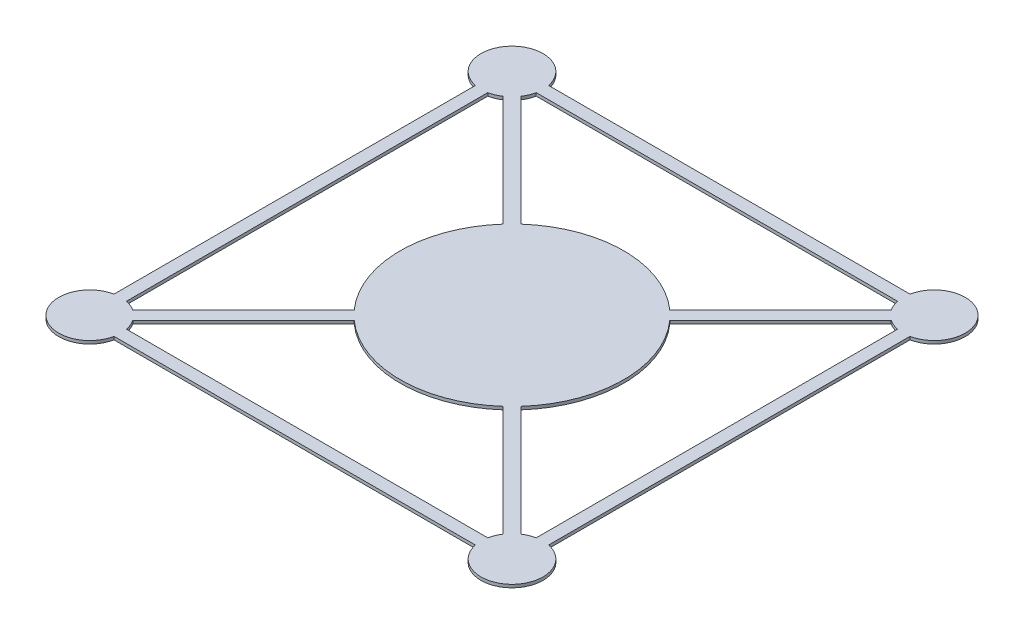
ISO-10303-21;
HEADER;
FILE_DESCRIPTION(('STEP AP214'),'2;1');
FILE_NAME('part.step','',(''),(''),'','','');
FILE_SCHEMA(('AUTOMOTIVE_DESIGN { 1 0 10303 214 1 1 1 1 }'));
ENDSEC;
DATA;
#1=APPLICATION_CONTEXT('core data for automotive mechanical design processes');
#2=APPLICATION_PROTOCOL_DEFINITION('international standard','automotive_design',2000,#1);
#3=PRODUCT_CONTEXT('',#1,'mechanical');
#4=PRODUCT('Part','Part','',(#3));
#5=PRODUCT_RELATED_PRODUCT_CATEGORY('part','',(#4));
#6=PRODUCT_DEFINITION_FORMATION('','',#4);
#7=PRODUCT_DEFINITION_CONTEXT('part definition',#1,'design');
#8=PRODUCT_DEFINITION('design','',#6,#7);
#9=PRODUCT_DEFINITION_SHAPE('','',#8);
#10=(LENGTH_UNIT() NAMED_UNIT(*) SI_UNIT(.MILLI.,.METRE.));
#11=(NAMED_UNIT(*) PLANE_ANGLE_UNIT() SI_UNIT($,.RADIAN.));
#12=(NAMED_UNIT(*) SI_UNIT($,.STERADIAN.) SOLID_ANGLE_UNIT());
#13=UNCERTAINTY_MEASURE_WITH_UNIT(LENGTH_MEASURE(1.E-05),#10,'distance_accuracy_value','');
#14=(GEOMETRIC_REPRESENTATION_CONTEXT(3) GLOBAL_UNCERTAINTY_ASSIGNED_CONTEXT((#13)) GLOBAL_UNIT_ASSIGNED_CONTEXT((#10,
#11,#12)) REPRESENTATION_CONTEXT('',''));
#15=CARTESIAN_POINT('',(0.,0.,0.));
#16=DIRECTION('',(0.,0.,1.));
#17=DIRECTION('',(1.,0.,0.));
#18=AXIS2_PLACEMENT_3D('',#15,#16,#17);
#19=CARTESIAN_POINT('',(0.,1.5748,0.));
#20=DIRECTION('',(0.,1.,0.));
#21=DIRECTION('',(0.,0.,1.));
#22=AXIS2_PLACEMENT_3D('',#19,#20,#21);
#23=PLANE('',#22);
#24=DIRECTION('',(0.707106781186547,0.,0.707106781186548));
#25=VECTOR('',#24,1.);
#26=CARTESIAN_POINT('',(150.543805491433,1.5748,-69.8463225691015));
#27=LINE('',#26,#25);
#28=CARTESIAN_POINT('',(150.543805491433,1.5748,-69.8463225691015));
#29=VERTEX_POINT('',#28);
#30=CARTESIAN_POINT('',(207.146541402205,1.5748,-13.2435866583297));
#31=VERTEX_POINT('',#30);
#32=EDGE_CURVE('E299',#29,#31,#27,.T.);
#33=ORIENTED_EDGE('',*,*,#32,.F.);
#34=CARTESIAN_POINT('',(107.95,1.5748,-107.95));
#35=DIRECTION('',(0.,-1.,0.));
#36=DIRECTION('',(0.,0.,1.));
#37=AXIS2_PLACEMENT_3D('',#34,#35,#36);
#38=CIRCLE('',#37,57.15);
#39=CARTESIAN_POINT('',(150.543805491433,1.5748,-146.053677430899));
#40=VERTEX_POINT('',#39);
#41=EDGE_CURVE('E297',#40,#29,#38,.T.);
#42=ORIENTED_EDGE('',*,*,#41,.F.);
#43=DIRECTION('',(-0.707106781186547,0.,0.707106781186548));
#44=VECTOR('',#43,1.);
#45=CARTESIAN_POINT('',(150.543805491433,1.5748,-146.053677430899));
#46=LINE('',#45,#44);
#47=CARTESIAN_POINT('',(207.146541402205,1.5748,-202.65641334167));
#48=VERTEX_POINT('',#47);
#49=EDGE_CURVE('E309',#48,#40,#46,.T.);
#50=ORIENTED_EDGE('',*,*,#49,.F.);
#51=CARTESIAN_POINT('',(215.9,1.5748,-215.9));
#52=DIRECTION('',(0.,-1.,0.));
#53=DIRECTION('',(0.,0.,1.));
#54=AXIS2_PLACEMENT_3D('',#51,#52,#53);
#55=CIRCLE('',#54,15.875);
#56=CARTESIAN_POINT('',(212.725,1.5748,-200.345740133327));
#57=VERTEX_POINT('',#56);
#58=EDGE_CURVE('E306',#57,#48,#55,.T.);
#59=ORIENTED_EDGE('',*,*,#58,.F.);
#60=DIRECTION('',(0.,0.,-1.));
#61=VECTOR('',#60,1.);
#62=CARTESIAN_POINT('',(212.725,1.5748,-15.5542598666732));
#63=LINE('',#62,#61);
#64=CARTESIAN_POINT('',(212.725,1.5748,-15.5542598666732));
#65=VERTEX_POINT('',#64);
#66=EDGE_CURVE('E304',#65,#57,#63,.T.);
#67=ORIENTED_EDGE('',*,*,#66,.F.);
#68=CARTESIAN_POINT('',(215.9,1.5748,0.));
#69=DIRECTION('',(0.,-1.,0.));
#70=DIRECTION('',(0.,0.,1.));
#71=AXIS2_PLACEMENT_3D('',#68,#69,#70);
#72=CIRCLE('',#71,15.875);
#73=EDGE_CURVE('E302',#31,#65,#72,.T.);
#74=ORIENTED_EDGE('',*,*,#73,.F.);
#75=EDGE_LOOP('',(#33,#42,#50,#59,#67,#74));
#76=FACE_BOUND('',#75,.T.);
#77=DIRECTION('',(-1.,0.,0.));
#78=VECTOR('',#77,1.);
#79=CARTESIAN_POINT('',(15.5542598666732,1.5748,-212.725));
#80=LINE('',#79,#78);
#81=CARTESIAN_POINT('',(200.345740133327,1.5748,-212.725));
#82=VERTEX_POINT('',#81);
#83=CARTESIAN_POINT('',(15.5542598666732,1.5748,-212.725));
#84=VERTEX_POINT('',#83);
#85=EDGE_CURVE('E389',#82,#84,#80,.T.);
#86=ORIENTED_EDGE('',*,*,#85,.F.);
#87=CARTESIAN_POINT('',(215.9,1.5748,-215.9));
#88=DIRECTION('',(0.,-1.,0.));
#89=DIRECTION('',(0.,0.,1.));
#90=AXIS2_PLACEMENT_3D('',#87,#88,#89);
#91=CIRCLE('',#90,15.875);
#92=CARTESIAN_POINT('',(202.65641334167,1.5748,-207.146541402205));
#93=VERTEX_POINT('',#92);
#94=EDGE_CURVE('E387',#93,#82,#91,.T.);
#95=ORIENTED_EDGE('',*,*,#94,.F.);
#96=DIRECTION('',(0.707106781186548,0.,-0.707106781186547));
#97=VECTOR('',#96,1.);
#98=CARTESIAN_POINT('',(146.053677430899,1.5748,-150.543805491433));
#99=LINE('',#98,#97);
#100=CARTESIAN_POINT('',(146.053677430899,1.5748,-150.543805491433));
#101=VERTEX_POINT('',#100);
#102=EDGE_CURVE('E399',#101,#93,#99,.T.);
#103=ORIENTED_EDGE('',*,*,#102,.F.);
#104=CARTESIAN_POINT('',(107.95,1.5748,-107.95));
#105=DIRECTION('',(0.,-1.,0.));
#106=DIRECTION('',(0.,0.,1.));
#107=AXIS2_PLACEMENT_3D('',#104,#105,#106);
#108=CIRCLE('',#107,57.15);
#109=CARTESIAN_POINT('',(69.8463225691014,1.5748,-150.543805491433));
#110=VERTEX_POINT('',#109);
#111=EDGE_CURVE('E396',#110,#101,#108,.T.);
#112=ORIENTED_EDGE('',*,*,#111,.F.);
#113=DIRECTION('',(0.707106781186548,0.,0.707106781186548));
#114=VECTOR('',#113,1.);
#115=CARTESIAN_POINT('',(13.2435866583297,1.5748,-207.146541402205));
#116=LINE('',#115,#114);
#117=CARTESIAN_POINT('',(13.2435866583297,1.5748,-207.146541402205));
#118=VERTEX_POINT('',#117);
#119=EDGE_CURVE('E394',#118,#110,#116,.T.);
#120=ORIENTED_EDGE('',*,*,#119,.F.);
#121=CARTESIAN_POINT('',(0.,1.5748,-215.9));
#122=DIRECTION('',(0.,-1.,0.));
#123=DIRECTION('',(0.,0.,1.));
#124=AXIS2_PLACEMENT_3D('',#121,#122,#123);
#125=CIRCLE('',#124,15.875);
#126=EDGE_CURVE('E392',#84,#118,#125,.T.);
#127=ORIENTED_EDGE('',*,*,#126,.F.);
#128=EDGE_LOOP('',(#86,#95,#103,#112,#120,#127));
#129=FACE_BOUND('',#128,.T.);
#130=CARTESIAN_POINT('',(0.,1.5748,0.));
#131=DIRECTION('',(0.,1.,0.));
#132=DIRECTION('',(0.,0.,1.));
#133=AXIS2_PLACEMENT_3D('',#130,#131,#132);
#134=CIRCLE('',#133,15.875);
#135=CARTESIAN_POINT('',(-3.175,1.5748,-15.5542598666732));
#136=VERTEX_POINT('',#135);
#137=CARTESIAN_POINT('',(15.5542598666732,1.5748,3.175));
#138=VERTEX_POINT('',#137);
#139=EDGE_CURVE('E432',#136,#138,#134,.T.);
#140=ORIENTED_EDGE('',*,*,#139,.T.);
#141=DIRECTION('',(1.,0.,0.));
#142=VECTOR('',#141,1.);
#143=CARTESIAN_POINT('',(15.5542598666732,1.5748,3.175));
#144=LINE('',#143,#142);
#145=CARTESIAN_POINT('',(200.345740133327,1.5748,3.175));
#146=VERTEX_POINT('',#145);
#147=EDGE_CURVE('E435',#138,#146,#144,.T.);
#148=ORIENTED_EDGE('',*,*,#147,.T.);
#149=CARTESIAN_POINT('',(215.9,1.5748,0.));
#150=DIRECTION('',(0.,1.,0.));
#151=DIRECTION('',(0.,0.,1.));
#152=AXIS2_PLACEMENT_3D('',#149,#150,#151);
#153=CIRCLE('',#152,15.875);
#154=CARTESIAN_POINT('',(219.075,1.5748,-15.5542598666732));
#155=VERTEX_POINT('',#154);
#156=EDGE_CURVE('E438',#146,#155,#153,.T.);
#157=ORIENTED_EDGE('',*,*,#156,.T.);
#158=DIRECTION('',(0.,0.,-1.));
#159=VECTOR('',#158,1.);
#160=CARTESIAN_POINT('',(219.075,1.5748,-15.5542598666732));
#161=LINE('',#160,#159);
#162=CARTESIAN_POINT('',(219.075,1.5748,-200.345740133327));
#163=VERTEX_POINT('',#162);
#164=EDGE_CURVE('E440',#155,#163,#161,.T.);
#165=ORIENTED_EDGE('',*,*,#164,.T.);
#166=CARTESIAN_POINT('',(215.9,1.5748,-215.9));
#167=DIRECTION('',(0.,1.,0.));
#168=DIRECTION('',(0.,0.,1.));
#169=AXIS2_PLACEMENT_3D('',#166,#167,#168);
#170=CIRCLE('',#169,15.875);
#171=CARTESIAN_POINT('',(200.345740133327,1.5748,-219.075));
#172=VERTEX_POINT('',#171);
#173=EDGE_CURVE('E442',#163,#172,#170,.T.);
#174=ORIENTED_EDGE('',*,*,#173,.T.);
#175=DIRECTION('',(-1.,0.,0.));
#176=VECTOR('',#175,1.);
#177=CARTESIAN_POINT('',(15.5542598666732,1.5748,-219.075));
#178=LINE('',#177,#176);
#179=CARTESIAN_POINT('',(15.5542598666732,1.5748,-219.075));
#180=VERTEX_POINT('',#179);
#181=EDGE_CURVE('E444',#172,#180,#178,.T.);
#182=ORIENTED_EDGE('',*,*,#181,.T.);
#183=CARTESIAN_POINT('',(0.,1.5748,-215.9));
#184=DIRECTION('',(0.,1.,0.));
#185=DIRECTION('',(0.,0.,1.));
#186=AXIS2_PLACEMENT_3D('',#183,#184,#185);
#187=CIRCLE('',#186,15.875);
#188=CARTESIAN_POINT('',(-3.17500000000001,1.5748,-200.345740133327));
#189=VERTEX_POINT('',#188);
#190=EDGE_CURVE('E446',#180,#189,#187,.T.);
#191=ORIENTED_EDGE('',*,*,#190,.T.);
#192=DIRECTION('',(0.,0.,1.));
#193=VECTOR('',#192,1.);
#194=CARTESIAN_POINT('',(-3.175,1.5748,-15.5542598666732));
#195=LINE('',#194,#193);
#196=EDGE_CURVE('E448',#189,#136,#195,.T.);
#197=ORIENTED_EDGE('',*,*,#196,.T.);
#198=EDGE_LOOP('',(#140,#148,#157,#165,#174,#182,#191,#197));
#199=FACE_BOUND('',#198,.T.);
#200=DIRECTION('',(1.,0.,0.));
#201=VECTOR('',#200,1.);
#202=CARTESIAN_POINT('',(15.5542598666732,1.5748,-3.175));
#203=LINE('',#202,#201);
#204=CARTESIAN_POINT('',(15.5542598666732,1.5748,-3.175));
#205=VERTEX_POINT('',#204);
#206=CARTESIAN_POINT('',(200.345740133327,1.5748,-3.175));
#207=VERTEX_POINT('',#206);
#208=EDGE_CURVE('E344',#205,#207,#203,.T.);
#209=ORIENTED_EDGE('',*,*,#208,.F.);
#210=CARTESIAN_POINT('',(0.,1.5748,0.));
#211=DIRECTION('',(0.,-1.,0.));
#212=DIRECTION('',(0.,0.,1.));
#213=AXIS2_PLACEMENT_3D('',#210,#211,#212);
#214=CIRCLE('',#213,15.875);
#215=CARTESIAN_POINT('',(13.2435866583297,1.5748,-8.75345859779509));
#216=VERTEX_POINT('',#215);
#217=EDGE_CURVE('E342',#216,#205,#214,.T.);
#218=ORIENTED_EDGE('',*,*,#217,.F.);
#219=DIRECTION('',(-0.707106781186547,0.,0.707106781186548));
#220=VECTOR('',#219,1.);
#221=CARTESIAN_POINT('',(13.2435866583297,1.5748,-8.75345859779509));
#222=LINE('',#221,#220);
#223=CARTESIAN_POINT('',(69.8463225691014,1.5748,-65.3561945085669));
#224=VERTEX_POINT('',#223);
#225=EDGE_CURVE('E354',#224,#216,#222,.T.);
#226=ORIENTED_EDGE('',*,*,#225,.F.);
#227=CARTESIAN_POINT('',(107.95,1.5748,-107.95));
#228=DIRECTION('',(0.,-1.,0.));
#229=DIRECTION('',(0.,0.,1.));
#230=AXIS2_PLACEMENT_3D('',#227,#228,#229);
#231=CIRCLE('',#230,57.15);
#232=CARTESIAN_POINT('',(146.053677430898,1.5748,-65.3561945085669));
#233=VERTEX_POINT('',#232);
#234=EDGE_CURVE('E351',#233,#224,#231,.T.);
#235=ORIENTED_EDGE('',*,*,#234,.F.);
#236=DIRECTION('',(-0.707106781186548,0.,-0.707106781186547));
#237=VECTOR('',#236,1.);
#238=CARTESIAN_POINT('',(146.053677430898,1.5748,-65.3561945085669));
#239=LINE('',#238,#237);
#240=CARTESIAN_POINT('',(202.65641334167,1.5748,-8.75345859779509));
#241=VERTEX_POINT('',#240);
#242=EDGE_CURVE('E349',#241,#233,#239,.T.);
#243=ORIENTED_EDGE('',*,*,#242,.F.);
#244=CARTESIAN_POINT('',(215.9,1.5748,0.));
#245=DIRECTION('',(0.,-1.,0.));
#246=DIRECTION('',(0.,0.,1.));
#247=AXIS2_PLACEMENT_3D('',#244,#245,#246);
#248=CIRCLE('',#247,15.875);
#249=EDGE_CURVE('E347',#207,#241,#248,.T.);
#250=ORIENTED_EDGE('',*,*,#249,.F.);
#251=EDGE_LOOP('',(#209,#218,#226,#235,#243,#250));
#252=FACE_BOUND('',#251,.T.);
#253=DIRECTION('',(0.,0.,1.));
#254=VECTOR('',#253,1.);
#255=CARTESIAN_POINT('',(3.175,1.5748,-15.5542598666732));
#256=LINE('',#255,#254);
#257=CARTESIAN_POINT('',(3.17500000000001,1.5748,-200.345740133327));
#258=VERTEX_POINT('',#257);
#259=CARTESIAN_POINT('',(3.175,1.5748,-15.5542598666732));
#260=VERTEX_POINT('',#259);
#261=EDGE_CURVE('E254',#258,#260,#256,.T.);
#262=ORIENTED_EDGE('',*,*,#261,.F.);
#263=CARTESIAN_POINT('',(0.,1.5748,-215.9));
#264=DIRECTION('',(0.,-1.,0.));
#265=DIRECTION('',(0.,0.,1.));
#266=AXIS2_PLACEMENT_3D('',#263,#264,#265);
#267=CIRCLE('',#266,15.875);
#268=CARTESIAN_POINT('',(8.75345859779508,1.5748,-202.65641334167));
#269=VERTEX_POINT('',#268);
#270=EDGE_CURVE('E246',#269,#258,#267,.T.);
#271=ORIENTED_EDGE('',*,*,#270,.F.);
#272=DIRECTION('',(-0.707106781186548,0.,-0.707106781186547));
#273=VECTOR('',#272,1.);
#274=CARTESIAN_POINT('',(8.75345859779508,1.5748,-202.65641334167));
#275=LINE('',#274,#273);
#276=CARTESIAN_POINT('',(65.3561945085668,1.5748,-146.053677430899));
#277=VERTEX_POINT('',#276);
#278=EDGE_CURVE('E275',#277,#269,#275,.T.);
#279=ORIENTED_EDGE('',*,*,#278,.F.);
#280=CARTESIAN_POINT('',(107.95,1.5748,-107.95));
#281=DIRECTION('',(0.,-1.,0.));
#282=DIRECTION('',(0.,0.,1.));
#283=AXIS2_PLACEMENT_3D('',#280,#281,#282);
#284=CIRCLE('',#283,57.15);
#285=CARTESIAN_POINT('',(65.3561945085669,1.5748,-69.8463225691015));
#286=VERTEX_POINT('',#285);
#287=EDGE_CURVE('E273',#286,#277,#284,.T.);
#288=ORIENTED_EDGE('',*,*,#287,.F.);
#289=DIRECTION('',(0.707106781186547,0.,-0.707106781186548));
#290=VECTOR('',#289,1.);
#291=CARTESIAN_POINT('',(8.75345859779509,1.5748,-13.2435866583297));
#292=LINE('',#291,#290);
#293=CARTESIAN_POINT('',(8.75345859779509,1.5748,-13.2435866583297));
#294=VERTEX_POINT('',#293);
#295=EDGE_CURVE('E269',#294,#286,#292,.T.);
#296=ORIENTED_EDGE('',*,*,#295,.F.);
#297=CARTESIAN_POINT('',(0.,1.5748,0.));
#298=DIRECTION('',(0.,-1.,0.));
#299=DIRECTION('',(0.,0.,1.));
#300=AXIS2_PLACEMENT_3D('',#297,#298,#299);
#301=CIRCLE('',#300,15.875);
#302=EDGE_CURVE('E267',#260,#294,#301,.T.);
#303=ORIENTED_EDGE('',*,*,#302,.F.);
#304=EDGE_LOOP('',(#262,#271,#279,#288,#296,#303));
#305=FACE_BOUND('',#304,.T.);
#306=ADVANCED_FACE('F37',(#76,#129,#199,#252,#305),#23,.T.);
#307=CARTESIAN_POINT('',(0.,0.,0.));
#308=DIRECTION('',(0.,1.,0.));
#309=DIRECTION('',(0.,0.,1.));
#310=AXIS2_PLACEMENT_3D('',#307,#308,#309);
#311=PLANE('',#310);
#312=CARTESIAN_POINT('',(107.95,0.,-107.95));
#313=DIRECTION('',(0.,-1.,0.));
#314=DIRECTION('',(0.,0.,1.));
#315=AXIS2_PLACEMENT_3D('',#312,#313,#314);
#316=CIRCLE('',#315,57.15);
#317=CARTESIAN_POINT('',(150.543805491433,0.,-146.053677430899));
#318=VERTEX_POINT('',#317);
#319=CARTESIAN_POINT('',(150.543805491433,0.,-69.8463225691015));
#320=VERTEX_POINT('',#319);
#321=EDGE_CURVE('E262',#318,#320,#316,.T.);
#322=ORIENTED_EDGE('',*,*,#321,.T.);
#323=DIRECTION('',(0.707106781186547,0.,0.707106781186548));
#324=VECTOR('',#323,1.);
#325=CARTESIAN_POINT('',(150.543805491433,0.,-69.8463225691015));
#326=LINE('',#325,#324);
#327=CARTESIAN_POINT('',(207.146541402205,0.,-13.2435866583297));
#328=VERTEX_POINT('',#327);
#329=EDGE_CURVE('E314',#320,#328,#326,.T.);
#330=ORIENTED_EDGE('',*,*,#329,.T.);
#331=CARTESIAN_POINT('',(215.9,0.,0.));
#332=DIRECTION('',(0.,-1.,0.));
#333=DIRECTION('',(0.,0.,1.));
#334=AXIS2_PLACEMENT_3D('',#331,#332,#333);
#335=CIRCLE('',#334,15.875);
#336=CARTESIAN_POINT('',(212.725,0.,-15.5542598666732));
#337=VERTEX_POINT('',#336);
#338=EDGE_CURVE('E317',#328,#337,#335,.T.);
#339=ORIENTED_EDGE('',*,*,#338,.T.);
#340=DIRECTION('',(0.,0.,-1.));
#341=VECTOR('',#340,1.);
#342=CARTESIAN_POINT('',(212.725,0.,-15.5542598666732));
#343=LINE('',#342,#341);
#344=CARTESIAN_POINT('',(212.725,0.,-200.345740133327));
#345=VERTEX_POINT('',#344);
#346=EDGE_CURVE('E320',#337,#345,#343,.T.);
#347=ORIENTED_EDGE('',*,*,#346,.T.);
#348=CARTESIAN_POINT('',(215.9,0.,-215.9));
#349=DIRECTION('',(0.,-1.,0.));
#350=DIRECTION('',(0.,0.,1.));
#351=AXIS2_PLACEMENT_3D('',#348,#349,#350);
#352=CIRCLE('',#351,15.875);
#353=CARTESIAN_POINT('',(207.146541402205,0.,-202.65641334167));
#354=VERTEX_POINT('',#353);
#355=EDGE_CURVE('E323',#345,#354,#352,.T.);
#356=ORIENTED_EDGE('',*,*,#355,.T.);
#357=DIRECTION('',(-0.707106781186547,0.,0.707106781186548));
#358=VECTOR('',#357,1.);
#359=CARTESIAN_POINT('',(150.543805491433,0.,-146.053677430899));
#360=LINE('',#359,#358);
#361=EDGE_CURVE('E300',#354,#318,#360,.T.);
#362=ORIENTED_EDGE('',*,*,#361,.T.);
#363=EDGE_LOOP('',(#322,#330,#339,#347,#356,#362));
#364=FACE_BOUND('',#363,.T.);
#365=CARTESIAN_POINT('',(215.9,0.,-215.9));
#366=DIRECTION('',(0.,-1.,0.));
#367=DIRECTION('',(0.,0.,1.));
#368=AXIS2_PLACEMENT_3D('',#365,#366,#367);
#369=CIRCLE('',#368,15.875);
#370=CARTESIAN_POINT('',(202.65641334167,0.,-207.146541402205));
#371=VERTEX_POINT('',#370);
#372=CARTESIAN_POINT('',(200.345740133327,0.,-212.725));
#373=VERTEX_POINT('',#372);
#374=EDGE_CURVE('E386',#371,#373,#369,.T.);
#375=ORIENTED_EDGE('',*,*,#374,.T.);
#376=DIRECTION('',(-1.,0.,0.));
#377=VECTOR('',#376,1.);
#378=CARTESIAN_POINT('',(15.5542598666732,0.,-212.725));
#379=LINE('',#378,#377);
#380=CARTESIAN_POINT('',(15.5542598666732,0.,-212.725));
#381=VERTEX_POINT('',#380);
#382=EDGE_CURVE('E404',#373,#381,#379,.T.);
#383=ORIENTED_EDGE('',*,*,#382,.T.);
#384=CARTESIAN_POINT('',(0.,0.,-215.9));
#385=DIRECTION('',(0.,-1.,0.));
#386=DIRECTION('',(0.,0.,1.));
#387=AXIS2_PLACEMENT_3D('',#384,#385,#386);
#388=CIRCLE('',#387,15.875);
#389=CARTESIAN_POINT('',(13.2435866583297,0.,-207.146541402205));
#390=VERTEX_POINT('',#389);
#391=EDGE_CURVE('E407',#381,#390,#388,.T.);
#392=ORIENTED_EDGE('',*,*,#391,.T.);
#393=DIRECTION('',(0.707106781186548,0.,0.707106781186548));
#394=VECTOR('',#393,1.);
#395=CARTESIAN_POINT('',(13.2435866583297,0.,-207.146541402205));
#396=LINE('',#395,#394);
#397=CARTESIAN_POINT('',(69.8463225691014,0.,-150.543805491433));
#398=VERTEX_POINT('',#397);
#399=EDGE_CURVE('E410',#390,#398,#396,.T.);
#400=ORIENTED_EDGE('',*,*,#399,.T.);
#401=CARTESIAN_POINT('',(107.95,0.,-107.95));
#402=DIRECTION('',(0.,-1.,0.));
#403=DIRECTION('',(0.,0.,1.));
#404=AXIS2_PLACEMENT_3D('',#401,#402,#403);
#405=CIRCLE('',#404,57.15);
#406=CARTESIAN_POINT('',(146.053677430899,0.,-150.543805491433));
#407=VERTEX_POINT('',#406);
#408=EDGE_CURVE('E413',#398,#407,#405,.T.);
#409=ORIENTED_EDGE('',*,*,#408,.T.);
#410=DIRECTION('',(0.707106781186548,0.,-0.707106781186547));
#411=VECTOR('',#410,1.);
#412=CARTESIAN_POINT('',(146.053677430899,0.,-150.543805491433));
#413=LINE('',#412,#411);
#414=EDGE_CURVE('E390',#407,#371,#413,.T.);
#415=ORIENTED_EDGE('',*,*,#414,.T.);
#416=EDGE_LOOP('',(#375,#383,#392,#400,#409,#415));
#417=FACE_BOUND('',#416,.T.);
#418=CARTESIAN_POINT('',(0.,0.,0.));
#419=DIRECTION('',(0.,1.,0.));
#420=DIRECTION('',(0.,0.,1.));
#421=AXIS2_PLACEMENT_3D('',#418,#419,#420);
#422=CIRCLE('',#421,15.875);
#423=CARTESIAN_POINT('',(-3.175,0.,-15.5542598666732));
#424=VERTEX_POINT('',#423);
#425=CARTESIAN_POINT('',(15.5542598666732,0.,3.175));
#426=VERTEX_POINT('',#425);
#427=EDGE_CURVE('E431',#424,#426,#422,.T.);
#428=ORIENTED_EDGE('',*,*,#427,.F.);
#429=DIRECTION('',(0.,0.,1.));
#430=VECTOR('',#429,1.);
#431=CARTESIAN_POINT('',(-3.175,0.,-15.5542598666732));
#432=LINE('',#431,#430);
#433=CARTESIAN_POINT('',(-3.17500000000001,0.,-200.345740133327));
#434=VERTEX_POINT('',#433);
#435=EDGE_CURVE('E436',#434,#424,#432,.T.);
#436=ORIENTED_EDGE('',*,*,#435,.F.);
#437=CARTESIAN_POINT('',(0.,0.,-215.9));
#438=DIRECTION('',(0.,1.,0.));
#439=DIRECTION('',(0.,0.,1.));
#440=AXIS2_PLACEMENT_3D('',#437,#438,#439);
#441=CIRCLE('',#440,15.875);
#442=CARTESIAN_POINT('',(15.5542598666732,0.,-219.075));
#443=VERTEX_POINT('',#442);
#444=EDGE_CURVE('E463',#443,#434,#441,.T.);
#445=ORIENTED_EDGE('',*,*,#444,.F.);
#446=DIRECTION('',(-1.,0.,0.));
#447=VECTOR('',#446,1.);
#448=CARTESIAN_POINT('',(15.5542598666732,0.,-219.075));
#449=LINE('',#448,#447);
#450=CARTESIAN_POINT('',(200.345740133327,0.,-219.075));
#451=VERTEX_POINT('',#450);
#452=EDGE_CURVE('E461',#451,#443,#449,.T.);
#453=ORIENTED_EDGE('',*,*,#452,.F.);
#454=CARTESIAN_POINT('',(215.9,0.,-215.9));
#455=DIRECTION('',(0.,1.,0.));
#456=DIRECTION('',(0.,0.,1.));
#457=AXIS2_PLACEMENT_3D('',#454,#455,#456);
#458=CIRCLE('',#457,15.875);
#459=CARTESIAN_POINT('',(219.075,0.,-200.345740133327));
#460=VERTEX_POINT('',#459);
#461=EDGE_CURVE('E459',#460,#451,#458,.T.);
#462=ORIENTED_EDGE('',*,*,#461,.F.);
#463=DIRECTION('',(0.,0.,-1.));
#464=VECTOR('',#463,1.);
#465=CARTESIAN_POINT('',(219.075,0.,-15.5542598666732));
#466=LINE('',#465,#464);
#467=CARTESIAN_POINT('',(219.075,0.,-15.5542598666732));
#468=VERTEX_POINT('',#467);
#469=EDGE_CURVE('E457',#468,#460,#466,.T.);
#470=ORIENTED_EDGE('',*,*,#469,.F.);
#471=CARTESIAN_POINT('',(215.9,0.,0.));
#472=DIRECTION('',(0.,1.,0.));
#473=DIRECTION('',(0.,0.,1.));
#474=AXIS2_PLACEMENT_3D('',#471,#472,#473);
#475=CIRCLE('',#474,15.875);
#476=CARTESIAN_POINT('',(200.345740133327,0.,3.175));
#477=VERTEX_POINT('',#476);
#478=EDGE_CURVE('E455',#477,#468,#475,.T.);
#479=ORIENTED_EDGE('',*,*,#478,.F.);
#480=DIRECTION('',(1.,0.,0.));
#481=VECTOR('',#480,1.);
#482=CARTESIAN_POINT('',(15.5542598666732,0.,3.175));
#483=LINE('',#482,#481);
#484=EDGE_CURVE('E453',#426,#477,#483,.T.);
#485=ORIENTED_EDGE('',*,*,#484,.F.);
#486=EDGE_LOOP('',(#428,#436,#445,#453,#462,#470,#479,#485));
#487=FACE_BOUND('',#486,.T.);
#488=CARTESIAN_POINT('',(0.,0.,0.));
#489=DIRECTION('',(0.,-1.,0.));
#490=DIRECTION('',(0.,0.,1.));
#491=AXIS2_PLACEMENT_3D('',#488,#489,#490);
#492=CIRCLE('',#491,15.875);
#493=CARTESIAN_POINT('',(13.2435866583297,0.,-8.75345859779509));
#494=VERTEX_POINT('',#493);
#495=CARTESIAN_POINT('',(15.5542598666732,0.,-3.175));
#496=VERTEX_POINT('',#495);
#497=EDGE_CURVE('E341',#494,#496,#492,.T.);
#498=ORIENTED_EDGE('',*,*,#497,.T.);
#499=DIRECTION('',(1.,0.,0.));
#500=VECTOR('',#499,1.);
#501=CARTESIAN_POINT('',(15.5542598666732,0.,-3.175));
#502=LINE('',#501,#500);
#503=CARTESIAN_POINT('',(200.345740133327,0.,-3.175));
#504=VERTEX_POINT('',#503);
#505=EDGE_CURVE('E359',#496,#504,#502,.T.);
#506=ORIENTED_EDGE('',*,*,#505,.T.);
#507=CARTESIAN_POINT('',(215.9,0.,0.));
#508=DIRECTION('',(0.,-1.,0.));
#509=DIRECTION('',(0.,0.,1.));
#510=AXIS2_PLACEMENT_3D('',#507,#508,#509);
#511=CIRCLE('',#510,15.875);
#512=CARTESIAN_POINT('',(202.65641334167,0.,-8.75345859779509));
#513=VERTEX_POINT('',#512);
#514=EDGE_CURVE('E362',#504,#513,#511,.T.);
#515=ORIENTED_EDGE('',*,*,#514,.T.);
#516=DIRECTION('',(-0.707106781186548,0.,-0.707106781186547));
#517=VECTOR('',#516,1.);
#518=CARTESIAN_POINT('',(146.053677430898,0.,-65.3561945085669));
#519=LINE('',#518,#517);
#520=CARTESIAN_POINT('',(146.053677430898,0.,-65.3561945085669));
#521=VERTEX_POINT('',#520);
#522=EDGE_CURVE('E365',#513,#521,#519,.T.);
#523=ORIENTED_EDGE('',*,*,#522,.T.);
#524=CARTESIAN_POINT('',(107.95,0.,-107.95));
#525=DIRECTION('',(0.,-1.,0.));
#526=DIRECTION('',(0.,0.,1.));
#527=AXIS2_PLACEMENT_3D('',#524,#525,#526);
#528=CIRCLE('',#527,57.15);
#529=CARTESIAN_POINT('',(69.8463225691014,0.,-65.3561945085669));
#530=VERTEX_POINT('',#529);
#531=EDGE_CURVE('E368',#521,#530,#528,.T.);
#532=ORIENTED_EDGE('',*,*,#531,.T.);
#533=DIRECTION('',(-0.707106781186547,0.,0.707106781186548));
#534=VECTOR('',#533,1.);
#535=CARTESIAN_POINT('',(13.2435866583297,0.,-8.75345859779509));
#536=LINE('',#535,#534);
#537=EDGE_CURVE('E345',#530,#494,#536,.T.);
#538=ORIENTED_EDGE('',*,*,#537,.T.);
#539=EDGE_LOOP('',(#498,#506,#515,#523,#532,#538));
#540=FACE_BOUND('',#539,.T.);
#541=CARTESIAN_POINT('',(0.,0.,-215.9));
#542=DIRECTION('',(0.,-1.,0.));
#543=DIRECTION('',(0.,0.,1.));
#544=AXIS2_PLACEMENT_3D('',#541,#542,#543);
#545=CIRCLE('',#544,15.875);
#546=CARTESIAN_POINT('',(8.75345859779508,0.,-202.65641334167));
#547=VERTEX_POINT('',#546);
#548=CARTESIAN_POINT('',(3.17500000000001,0.,-200.345740133327));
#549=VERTEX_POINT('',#548);
#550=EDGE_CURVE('E60',#547,#549,#545,.T.);
#551=ORIENTED_EDGE('',*,*,#550,.T.);
#552=DIRECTION('',(0.,0.,1.));
#553=VECTOR('',#552,1.);
#554=CARTESIAN_POINT('',(3.175,0.,-15.5542598666732));
#555=LINE('',#554,#553);
#556=CARTESIAN_POINT('',(3.175,0.,-15.5542598666732));
#557=VERTEX_POINT('',#556);
#558=EDGE_CURVE('E261',#549,#557,#555,.T.);
#559=ORIENTED_EDGE('',*,*,#558,.T.);
#560=CARTESIAN_POINT('',(0.,0.,0.));
#561=DIRECTION('',(0.,-1.,0.));
#562=DIRECTION('',(0.,0.,1.));
#563=AXIS2_PLACEMENT_3D('',#560,#561,#562);
#564=CIRCLE('',#563,15.875);
#565=CARTESIAN_POINT('',(8.75345859779509,0.,-13.2435866583297));
#566=VERTEX_POINT('',#565);
#567=EDGE_CURVE('E279',#557,#566,#564,.T.);
#568=ORIENTED_EDGE('',*,*,#567,.T.);
#569=DIRECTION('',(0.707106781186547,0.,-0.707106781186548));
#570=VECTOR('',#569,1.);
#571=CARTESIAN_POINT('',(8.75345859779509,0.,-13.2435866583297));
#572=LINE('',#571,#570);
#573=CARTESIAN_POINT('',(65.3561945085669,0.,-69.8463225691015));
#574=VERTEX_POINT('',#573);
#575=EDGE_CURVE('E282',#566,#574,#572,.T.);
#576=ORIENTED_EDGE('',*,*,#575,.T.);
#577=CARTESIAN_POINT('',(107.95,0.,-107.95));
#578=DIRECTION('',(0.,-1.,0.));
#579=DIRECTION('',(0.,0.,1.));
#580=AXIS2_PLACEMENT_3D('',#577,#578,#579);
#581=CIRCLE('',#580,57.15);
#582=CARTESIAN_POINT('',(65.3561945085669,0.,-146.053677430899));
#583=VERTEX_POINT('',#582);
#584=EDGE_CURVE('E285',#574,#583,#581,.T.);
#585=ORIENTED_EDGE('',*,*,#584,.T.);
#586=DIRECTION('',(-0.707106781186548,0.,-0.707106781186547));
#587=VECTOR('',#586,1.);
#588=CARTESIAN_POINT('',(8.75345859779508,0.,-202.65641334167));
#589=LINE('',#588,#587);
#590=EDGE_CURVE('E255',#583,#547,#589,.T.);
#591=ORIENTED_EDGE('',*,*,#590,.T.);
#592=EDGE_LOOP('',(#551,#559,#568,#576,#585,#591));
#593=FACE_BOUND('',#592,.T.);
#594=ADVANCED_FACE('F493',(#364,#417,#487,#540,#593),#311,.F.);
#595=CARTESIAN_POINT('',(0.,1.5748,0.));
#596=DIRECTION('',(0.,-1.,0.));
#597=DIRECTION('',(0.,0.,-1.));
#598=AXIS2_PLACEMENT_3D('',#595,#596,#597);
#599=CYLINDRICAL_SURFACE('',#598,15.875);
#600=ORIENTED_EDGE('',*,*,#427,.T.);
#601=DIRECTION('',(0.,-1.,0.));
#602=VECTOR('',#601,1.);
#603=CARTESIAN_POINT('',(15.5542598666732,1.5748,3.175));
#604=LINE('',#603,#602);
#605=EDGE_CURVE('E11',#138,#426,#604,.T.);
#606=ORIENTED_EDGE('',*,*,#605,.F.);
#607=ORIENTED_EDGE('',*,*,#139,.F.);
#608=DIRECTION('',(0.,-1.,0.));
#609=VECTOR('',#608,1.);
#610=CARTESIAN_POINT('',(-3.175,1.5748,-15.5542598666732));
#611=LINE('',#610,#609);
#612=EDGE_CURVE('E450',#136,#424,#611,.T.);
#613=ORIENTED_EDGE('',*,*,#612,.T.);
#614=EDGE_LOOP('',(#600,#606,#607,#613));
#615=FACE_BOUND('',#614,.T.);
#616=ADVANCED_FACE('F39',(#615),#599,.T.);
#617=CARTESIAN_POINT('',(15.5542598666732,1.5748,3.175));
#618=DIRECTION('',(0.,0.,-1.));
#619=DIRECTION('',(-1.,0.,0.));
#620=AXIS2_PLACEMENT_3D('',#617,#618,#619);
#621=PLANE('',#620);
#622=ORIENTED_EDGE('',*,*,#484,.T.);
#623=DIRECTION('',(0.,-1.,0.));
#624=VECTOR('',#623,1.);
#625=CARTESIAN_POINT('',(200.345740133327,1.5748,3.175));
#626=LINE('',#625,#624);
#627=EDGE_CURVE('E45',#146,#477,#626,.T.);
#628=ORIENTED_EDGE('',*,*,#627,.F.);
#629=ORIENTED_EDGE('',*,*,#147,.F.);
#630=ORIENTED_EDGE('',*,*,#605,.T.);
#631=EDGE_LOOP('',(#622,#628,#629,#630));
#632=FACE_BOUND('',#631,.T.);
#633=ADVANCED_FACE('F511',(#632),#621,.F.);
#634=CARTESIAN_POINT('',(215.9,1.5748,0.));
#635=DIRECTION('',(0.,-1.,0.));
#636=DIRECTION('',(0.,0.,-1.));
#637=AXIS2_PLACEMENT_3D('',#634,#635,#636);
#638=CYLINDRICAL_SURFACE('',#637,15.875);
#639=ORIENTED_EDGE('',*,*,#478,.T.);
#640=DIRECTION('',(0.,-1.,0.));
#641=VECTOR('',#640,1.);
#642=CARTESIAN_POINT('',(219.075,1.5748,-15.5542598666732));
#643=LINE('',#642,#641);
#644=EDGE_CURVE('E480',#155,#468,#643,.T.);
#645=ORIENTED_EDGE('',*,*,#644,.F.);
#646=ORIENTED_EDGE('',*,*,#156,.F.);
#647=ORIENTED_EDGE('',*,*,#627,.T.);
#648=EDGE_LOOP('',(#639,#645,#646,#647));
#649=FACE_BOUND('',#648,.T.);
#650=ADVANCED_FACE('F487',(#649),#638,.T.);
#651=CARTESIAN_POINT('',(219.075,1.5748,-15.5542598666732));
#652=DIRECTION('',(-1.,0.,0.));
#653=DIRECTION('',(0.,0.,1.));
#654=AXIS2_PLACEMENT_3D('',#651,#652,#653);
#655=PLANE('',#654);
#656=ORIENTED_EDGE('',*,*,#469,.T.);
#657=DIRECTION('',(0.,-1.,0.));
#658=VECTOR('',#657,1.);
#659=CARTESIAN_POINT('',(219.075,1.5748,-200.345740133327));
#660=LINE('',#659,#658);
#661=EDGE_CURVE('E477',#163,#460,#660,.T.);
#662=ORIENTED_EDGE('',*,*,#661,.F.);
#663=ORIENTED_EDGE('',*,*,#164,.F.);
#664=ORIENTED_EDGE('',*,*,#644,.T.);
#665=EDGE_LOOP('',(#656,#662,#663,#664));
#666=FACE_BOUND('',#665,.T.);
#667=ADVANCED_FACE('F499',(#666),#655,.F.);
#668=CARTESIAN_POINT('',(215.9,1.5748,-215.9));
#669=DIRECTION('',(0.,-1.,0.));
#670=DIRECTION('',(0.,0.,-1.));
#671=AXIS2_PLACEMENT_3D('',#668,#669,#670);
#672=CYLINDRICAL_SURFACE('',#671,15.875);
#673=ORIENTED_EDGE('',*,*,#461,.T.);
#674=DIRECTION('',(0.,-1.,0.));
#675=VECTOR('',#674,1.);
#676=CARTESIAN_POINT('',(200.345740133327,1.5748,-219.075));
#677=LINE('',#676,#675);
#678=EDGE_CURVE('E474',#172,#451,#677,.T.);
#679=ORIENTED_EDGE('',*,*,#678,.F.);
#680=ORIENTED_EDGE('',*,*,#173,.F.);
#681=ORIENTED_EDGE('',*,*,#661,.T.);
#682=EDGE_LOOP('',(#673,#679,#680,#681));
#683=FACE_BOUND('',#682,.T.);
#684=ADVANCED_FACE('F503',(#683),#672,.T.);
#685=CARTESIAN_POINT('',(15.5542598666732,1.5748,-219.075));
#686=DIRECTION('',(0.,0.,1.));
#687=DIRECTION('',(1.,0.,0.));
#688=AXIS2_PLACEMENT_3D('',#685,#686,#687);
#689=PLANE('',#688);
#690=ORIENTED_EDGE('',*,*,#452,.T.);
#691=DIRECTION('',(0.,-1.,0.));
#692=VECTOR('',#691,1.);
#693=CARTESIAN_POINT('',(15.5542598666732,1.5748,-219.075));
#694=LINE('',#693,#692);
#695=EDGE_CURVE('E471',#180,#443,#694,.T.);
#696=ORIENTED_EDGE('',*,*,#695,.F.);
#697=ORIENTED_EDGE('',*,*,#181,.F.);
#698=ORIENTED_EDGE('',*,*,#678,.T.);
#699=EDGE_LOOP('',(#690,#696,#697,#698));
#700=FACE_BOUND('',#699,.T.);
#701=ADVANCED_FACE('F524',(#700),#689,.F.);
#702=CARTESIAN_POINT('',(0.,1.5748,-215.9));
#703=DIRECTION('',(0.,-1.,0.));
#704=DIRECTION('',(0.,0.,-1.));
#705=AXIS2_PLACEMENT_3D('',#702,#703,#704);
#706=CYLINDRICAL_SURFACE('',#705,15.875);
#707=ORIENTED_EDGE('',*,*,#444,.T.);
#708=DIRECTION('',(0.,-1.,0.));
#709=VECTOR('',#708,1.);
#710=CARTESIAN_POINT('',(-3.17500000000001,1.5748,-200.345740133327));
#711=LINE('',#710,#709);
#712=EDGE_CURVE('E468',#189,#434,#711,.T.);
#713=ORIENTED_EDGE('',*,*,#712,.F.);
#714=ORIENTED_EDGE('',*,*,#190,.F.);
#715=ORIENTED_EDGE('',*,*,#695,.T.);
#716=EDGE_LOOP('',(#707,#713,#714,#715));
#717=FACE_BOUND('',#716,.T.);
#718=ADVANCED_FACE('F522',(#717),#706,.T.);
#719=CARTESIAN_POINT('',(-3.175,1.5748,-15.5542598666732));
#720=DIRECTION('',(1.,0.,0.));
#721=DIRECTION('',(0.,0.,-1.));
#722=AXIS2_PLACEMENT_3D('',#719,#720,#721);
#723=PLANE('',#722);
#724=ORIENTED_EDGE('',*,*,#435,.T.);
#725=ORIENTED_EDGE('',*,*,#612,.F.);
#726=ORIENTED_EDGE('',*,*,#196,.F.);
#727=ORIENTED_EDGE('',*,*,#712,.T.);
#728=EDGE_LOOP('',(#724,#725,#726,#727));
#729=FACE_BOUND('',#728,.T.);
#730=ADVANCED_FACE('F517',(#729),#723,.F.);
#731=CARTESIAN_POINT('',(215.9,1.5748,-215.9));
#732=DIRECTION('',(0.,-1.,0.));
#733=DIRECTION('',(0.,0.,-1.));
#734=AXIS2_PLACEMENT_3D('',#731,#732,#733);
#735=CYLINDRICAL_SURFACE('',#734,15.875);
#736=ORIENTED_EDGE('',*,*,#374,.F.);
#737=DIRECTION('',(0.,-1.,0.));
#738=VECTOR('',#737,1.);
#739=CARTESIAN_POINT('',(202.65641334167,1.5748,-207.146541402205));
#740=LINE('',#739,#738);
#741=EDGE_CURVE('E401',#93,#371,#740,.T.);
#742=ORIENTED_EDGE('',*,*,#741,.F.);
#743=ORIENTED_EDGE('',*,*,#94,.T.);
#744=DIRECTION('',(0.,-1.,0.));
#745=VECTOR('',#744,1.);
#746=CARTESIAN_POINT('',(200.345740133327,1.5748,-212.725));
#747=LINE('',#746,#745);
#748=EDGE_CURVE('E428',#82,#373,#747,.T.);
#749=ORIENTED_EDGE('',*,*,#748,.T.);
#750=EDGE_LOOP('',(#736,#742,#743,#749));
#751=FACE_BOUND('',#750,.T.);
#752=ADVANCED_FACE('F544',(#751),#735,.T.);
#753=CARTESIAN_POINT('',(15.5542598666732,1.5748,-212.725));
#754=DIRECTION('',(0.,0.,1.));
#755=DIRECTION('',(1.,0.,0.));
#756=AXIS2_PLACEMENT_3D('',#753,#754,#755);
#757=PLANE('',#756);
#758=ORIENTED_EDGE('',*,*,#382,.F.);
#759=ORIENTED_EDGE('',*,*,#748,.F.);
#760=ORIENTED_EDGE('',*,*,#85,.T.);
#761=DIRECTION('',(0.,-1.,0.));
#762=VECTOR('',#761,1.);
#763=CARTESIAN_POINT('',(15.5542598666732,1.5748,-212.725));
#764=LINE('',#763,#762);
#765=EDGE_CURVE('E426',#84,#381,#764,.T.);
#766=ORIENTED_EDGE('',*,*,#765,.T.);
#767=EDGE_LOOP('',(#758,#759,#760,#766));
#768=FACE_BOUND('',#767,.T.);
#769=ADVANCED_FACE('F551',(#768),#757,.T.);
#770=CARTESIAN_POINT('',(0.,1.5748,-215.9));
#771=DIRECTION('',(0.,-1.,0.));
#772=DIRECTION('',(0.,0.,-1.));
#773=AXIS2_PLACEMENT_3D('',#770,#771,#772);
#774=CYLINDRICAL_SURFACE('',#773,15.875);
#775=ORIENTED_EDGE('',*,*,#391,.F.);
#776=ORIENTED_EDGE('',*,*,#765,.F.);
#777=ORIENTED_EDGE('',*,*,#126,.T.);
#778=DIRECTION('',(0.,-1.,0.));
#779=VECTOR('',#778,1.);
#780=CARTESIAN_POINT('',(13.2435866583297,1.5748,-207.146541402205));
#781=LINE('',#780,#779);
#782=EDGE_CURVE('E424',#118,#390,#781,.T.);
#783=ORIENTED_EDGE('',*,*,#782,.T.);
#784=EDGE_LOOP('',(#775,#776,#777,#783));
#785=FACE_BOUND('',#784,.T.);
#786=ADVANCED_FACE('F556',(#785),#774,.T.);
#787=CARTESIAN_POINT('',(13.2435866583297,1.5748,-207.146541402205));
#788=DIRECTION('',(0.707106781186548,0.,-0.707106781186548));
#789=DIRECTION('',(-0.707106781186548,0.,-0.707106781186548));
#790=AXIS2_PLACEMENT_3D('',#787,#788,#789);
#791=PLANE('',#790);
#792=ORIENTED_EDGE('',*,*,#399,.F.);
#793=ORIENTED_EDGE('',*,*,#782,.F.);
#794=ORIENTED_EDGE('',*,*,#119,.T.);
#795=DIRECTION('',(0.,-1.,0.));
#796=VECTOR('',#795,1.);
#797=CARTESIAN_POINT('',(69.8463225691014,1.5748,-150.543805491433));
#798=LINE('',#797,#796);
#799=EDGE_CURVE('E422',#110,#398,#798,.T.);
#800=ORIENTED_EDGE('',*,*,#799,.T.);
#801=EDGE_LOOP('',(#792,#793,#794,#800));
#802=FACE_BOUND('',#801,.T.);
#803=ADVANCED_FACE('F580',(#802),#791,.T.);
#804=CARTESIAN_POINT('',(107.95,1.5748,-107.95));
#805=DIRECTION('',(0.,-1.,0.));
#806=DIRECTION('',(0.,0.,-1.));
#807=AXIS2_PLACEMENT_3D('',#804,#805,#806);
#808=CYLINDRICAL_SURFACE('',#807,57.15);
#809=ORIENTED_EDGE('',*,*,#408,.F.);
#810=ORIENTED_EDGE('',*,*,#799,.F.);
#811=ORIENTED_EDGE('',*,*,#111,.T.);
#812=DIRECTION('',(0.,-1.,0.));
#813=VECTOR('',#812,1.);
#814=CARTESIAN_POINT('',(146.053677430899,1.5748,-150.543805491433));
#815=LINE('',#814,#813);
#816=EDGE_CURVE('E420',#101,#407,#815,.T.);
#817=ORIENTED_EDGE('',*,*,#816,.T.);
#818=EDGE_LOOP('',(#809,#810,#811,#817));
#819=FACE_BOUND('',#818,.T.);
#820=ADVANCED_FACE('F570',(#819),#808,.T.);
#821=CARTESIAN_POINT('',(146.053677430899,1.5748,-150.543805491433));
#822=DIRECTION('',(-0.707106781186547,0.,-0.707106781186548));
#823=DIRECTION('',(-0.707106781186548,0.,0.707106781186547));
#824=AXIS2_PLACEMENT_3D('',#821,#822,#823);
#825=PLANE('',#824);
#826=ORIENTED_EDGE('',*,*,#414,.F.);
#827=ORIENTED_EDGE('',*,*,#816,.F.);
#828=ORIENTED_EDGE('',*,*,#102,.T.);
#829=ORIENTED_EDGE('',*,*,#741,.T.);
#830=EDGE_LOOP('',(#826,#827,#828,#829));
#831=FACE_BOUND('',#830,.T.);
#832=ADVANCED_FACE('F564',(#831),#825,.T.);
#833=CARTESIAN_POINT('',(0.,1.5748,0.));
#834=DIRECTION('',(0.,-1.,0.));
#835=DIRECTION('',(0.,0.,-1.));
#836=AXIS2_PLACEMENT_3D('',#833,#834,#835);
#837=CYLINDRICAL_SURFACE('',#836,15.875);
#838=ORIENTED_EDGE('',*,*,#497,.F.);
#839=DIRECTION('',(0.,-1.,0.));
#840=VECTOR('',#839,1.);
#841=CARTESIAN_POINT('',(13.2435866583297,1.5748,-8.75345859779509));
#842=LINE('',#841,#840);
#843=EDGE_CURVE('E356',#216,#494,#842,.T.);
#844=ORIENTED_EDGE('',*,*,#843,.F.);
#845=ORIENTED_EDGE('',*,*,#217,.T.);
#846=DIRECTION('',(0.,-1.,0.));
#847=VECTOR('',#846,1.);
#848=CARTESIAN_POINT('',(15.5542598666732,1.5748,-3.175));
#849=LINE('',#848,#847);
#850=EDGE_CURVE('E383',#205,#496,#849,.T.);
#851=ORIENTED_EDGE('',*,*,#850,.T.);
#852=EDGE_LOOP('',(#838,#844,#845,#851));
#853=FACE_BOUND('',#852,.T.);
#854=ADVANCED_FACE('F592',(#853),#837,.T.);
#855=CARTESIAN_POINT('',(15.5542598666732,1.5748,-3.175));
#856=DIRECTION('',(0.,0.,-1.));
#857=DIRECTION('',(-1.,0.,0.));
#858=AXIS2_PLACEMENT_3D('',#855,#856,#857);
#859=PLANE('',#858);
#860=ORIENTED_EDGE('',*,*,#505,.F.);
#861=ORIENTED_EDGE('',*,*,#850,.F.);
#862=ORIENTED_EDGE('',*,*,#208,.T.);
#863=DIRECTION('',(0.,-1.,0.));
#864=VECTOR('',#863,1.);
#865=CARTESIAN_POINT('',(200.345740133327,1.5748,-3.175));
#866=LINE('',#865,#864);
#867=EDGE_CURVE('E381',#207,#504,#866,.T.);
#868=ORIENTED_EDGE('',*,*,#867,.T.);
#869=EDGE_LOOP('',(#860,#861,#862,#868));
#870=FACE_BOUND('',#869,.T.);
#871=ADVANCED_FACE('F595',(#870),#859,.T.);
#872=CARTESIAN_POINT('',(215.9,1.5748,0.));
#873=DIRECTION('',(0.,-1.,0.));
#874=DIRECTION('',(0.,0.,-1.));
#875=AXIS2_PLACEMENT_3D('',#872,#873,#874);
#876=CYLINDRICAL_SURFACE('',#875,15.875);
#877=ORIENTED_EDGE('',*,*,#514,.F.);
#878=ORIENTED_EDGE('',*,*,#867,.F.);
#879=ORIENTED_EDGE('',*,*,#249,.T.);
#880=DIRECTION('',(0.,-1.,0.));
#881=VECTOR('',#880,1.);
#882=CARTESIAN_POINT('',(202.65641334167,1.5748,-8.75345859779509));
#883=LINE('',#882,#881);
#884=EDGE_CURVE('E379',#241,#513,#883,.T.);
#885=ORIENTED_EDGE('',*,*,#884,.T.);
#886=EDGE_LOOP('',(#877,#878,#879,#885));
#887=FACE_BOUND('',#886,.T.);
#888=ADVANCED_FACE('F599',(#887),#876,.T.);
#889=CARTESIAN_POINT('',(146.053677430898,1.5748,-65.3561945085669));
#890=DIRECTION('',(-0.707106781186547,0.,0.707106781186548));
#891=DIRECTION('',(0.707106781186548,0.,0.707106781186547));
#892=AXIS2_PLACEMENT_3D('',#889,#890,#891);
#893=PLANE('',#892);
#894=ORIENTED_EDGE('',*,*,#522,.F.);
#895=ORIENTED_EDGE('',*,*,#884,.F.);
#896=ORIENTED_EDGE('',*,*,#242,.T.);
#897=DIRECTION('',(0.,-1.,0.));
#898=VECTOR('',#897,1.);
#899=CARTESIAN_POINT('',(146.053677430898,1.5748,-65.3561945085669));
#900=LINE('',#899,#898);
#901=EDGE_CURVE('E377',#233,#521,#900,.T.);
#902=ORIENTED_EDGE('',*,*,#901,.T.);
#903=EDGE_LOOP('',(#894,#895,#896,#902));
#904=FACE_BOUND('',#903,.T.);
#905=ADVANCED_FACE('F603',(#904),#893,.T.);
#906=CARTESIAN_POINT('',(107.95,1.5748,-107.95));
#907=DIRECTION('',(0.,-1.,0.));
#908=DIRECTION('',(0.,0.,-1.));
#909=AXIS2_PLACEMENT_3D('',#906,#907,#908);
#910=CYLINDRICAL_SURFACE('',#909,57.15);
#911=ORIENTED_EDGE('',*,*,#531,.F.);
#912=ORIENTED_EDGE('',*,*,#901,.F.);
#913=ORIENTED_EDGE('',*,*,#234,.T.);
#914=DIRECTION('',(0.,-1.,0.));
#915=VECTOR('',#914,1.);
#916=CARTESIAN_POINT('',(69.8463225691014,1.5748,-65.3561945085669));
#917=LINE('',#916,#915);
#918=EDGE_CURVE('E375',#224,#530,#917,.T.);
#919=ORIENTED_EDGE('',*,*,#918,.T.);
#920=EDGE_LOOP('',(#911,#912,#913,#919));
#921=FACE_BOUND('',#920,.T.);
#922=ADVANCED_FACE('F607',(#921),#910,.T.);
#923=CARTESIAN_POINT('',(13.2435866583297,1.5748,-8.75345859779509));
#924=DIRECTION('',(0.707106781186548,0.,0.707106781186547));
#925=DIRECTION('',(0.707106781186547,0.,-0.707106781186548));
#926=AXIS2_PLACEMENT_3D('',#923,#924,#925);
#927=PLANE('',#926);
#928=ORIENTED_EDGE('',*,*,#537,.F.);
#929=ORIENTED_EDGE('',*,*,#918,.F.);
#930=ORIENTED_EDGE('',*,*,#225,.T.);
#931=ORIENTED_EDGE('',*,*,#843,.T.);
#932=EDGE_LOOP('',(#928,#929,#930,#931));
#933=FACE_BOUND('',#932,.T.);
#934=ADVANCED_FACE('F611',(#933),#927,.T.);
#935=CARTESIAN_POINT('',(107.95,1.5748,-107.95));
#936=DIRECTION('',(0.,-1.,0.));
#937=DIRECTION('',(0.,0.,-1.));
#938=AXIS2_PLACEMENT_3D('',#935,#936,#937);
#939=CYLINDRICAL_SURFACE('',#938,57.15);
#940=ORIENTED_EDGE('',*,*,#321,.F.);
#941=DIRECTION('',(0.,-1.,0.));
#942=VECTOR('',#941,1.);
#943=CARTESIAN_POINT('',(150.543805491433,1.5748,-146.053677430899));
#944=LINE('',#943,#942);
#945=EDGE_CURVE('E311',#40,#318,#944,.T.);
#946=ORIENTED_EDGE('',*,*,#945,.F.);
#947=ORIENTED_EDGE('',*,*,#41,.T.);
#948=DIRECTION('',(0.,-1.,0.));
#949=VECTOR('',#948,1.);
#950=CARTESIAN_POINT('',(150.543805491433,1.5748,-69.8463225691015));
#951=LINE('',#950,#949);
#952=EDGE_CURVE('E338',#29,#320,#951,.T.);
#953=ORIENTED_EDGE('',*,*,#952,.T.);
#954=EDGE_LOOP('',(#940,#946,#947,#953));
#955=FACE_BOUND('',#954,.T.);
#956=ADVANCED_FACE('F615',(#955),#939,.T.);
#957=CARTESIAN_POINT('',(150.543805491433,1.5748,-69.8463225691015));
#958=DIRECTION('',(0.707106781186548,0.,-0.707106781186547));
#959=DIRECTION('',(-0.707106781186547,0.,-0.707106781186548));
#960=AXIS2_PLACEMENT_3D('',#957,#958,#959);
#961=PLANE('',#960);
#962=ORIENTED_EDGE('',*,*,#329,.F.);
#963=ORIENTED_EDGE('',*,*,#952,.F.);
#964=ORIENTED_EDGE('',*,*,#32,.T.);
#965=DIRECTION('',(0.,-1.,0.));
#966=VECTOR('',#965,1.);
#967=CARTESIAN_POINT('',(207.146541402205,1.5748,-13.2435866583297));
#968=LINE('',#967,#966);
#969=EDGE_CURVE('E336',#31,#328,#968,.T.);
#970=ORIENTED_EDGE('',*,*,#969,.T.);
#971=EDGE_LOOP('',(#962,#963,#964,#970));
#972=FACE_BOUND('',#971,.T.);
#973=ADVANCED_FACE('F619',(#972),#961,.T.);
#974=CARTESIAN_POINT('',(215.9,1.5748,0.));
#975=DIRECTION('',(0.,-1.,0.));
#976=DIRECTION('',(0.,0.,-1.));
#977=AXIS2_PLACEMENT_3D('',#974,#975,#976);
#978=CYLINDRICAL_SURFACE('',#977,15.875);
#979=ORIENTED_EDGE('',*,*,#338,.F.);
#980=ORIENTED_EDGE('',*,*,#969,.F.);
#981=ORIENTED_EDGE('',*,*,#73,.T.);
#982=DIRECTION('',(0.,-1.,0.));
#983=VECTOR('',#982,1.);
#984=CARTESIAN_POINT('',(212.725,1.5748,-15.5542598666732));
#985=LINE('',#984,#983);
#986=EDGE_CURVE('E334',#65,#337,#985,.T.);
#987=ORIENTED_EDGE('',*,*,#986,.T.);
#988=EDGE_LOOP('',(#979,#980,#981,#987));
#989=FACE_BOUND('',#988,.T.);
#990=ADVANCED_FACE('F623',(#989),#978,.T.);
#991=CARTESIAN_POINT('',(212.725,1.5748,-15.5542598666732));
#992=DIRECTION('',(-1.,0.,0.));
#993=DIRECTION('',(0.,0.,1.));
#994=AXIS2_PLACEMENT_3D('',#991,#992,#993);
#995=PLANE('',#994);
#996=ORIENTED_EDGE('',*,*,#346,.F.);
#997=ORIENTED_EDGE('',*,*,#986,.F.);
#998=ORIENTED_EDGE('',*,*,#66,.T.);
#999=DIRECTION('',(0.,-1.,0.));
#1000=VECTOR('',#999,1.);
#1001=CARTESIAN_POINT('',(212.725,1.5748,-200.345740133327));
#1002=LINE('',#1001,#1000);
#1003=EDGE_CURVE('E332',#57,#345,#1002,.T.);
#1004=ORIENTED_EDGE('',*,*,#1003,.T.);
#1005=EDGE_LOOP('',(#996,#997,#998,#1004));
#1006=FACE_BOUND('',#1005,.T.);
#1007=ADVANCED_FACE('F627',(#1006),#995,.T.);
#1008=CARTESIAN_POINT('',(215.9,1.5748,-215.9));
#1009=DIRECTION('',(0.,-1.,0.));
#1010=DIRECTION('',(0.,0.,-1.));
#1011=AXIS2_PLACEMENT_3D('',#1008,#1009,#1010);
#1012=CYLINDRICAL_SURFACE('',#1011,15.875);
#1013=ORIENTED_EDGE('',*,*,#355,.F.);
#1014=ORIENTED_EDGE('',*,*,#1003,.F.);
#1015=ORIENTED_EDGE('',*,*,#58,.T.);
#1016=DIRECTION('',(0.,-1.,0.));
#1017=VECTOR('',#1016,1.);
#1018=CARTESIAN_POINT('',(207.146541402205,1.5748,-202.65641334167));
#1019=LINE('',#1018,#1017);
#1020=EDGE_CURVE('E330',#48,#354,#1019,.T.);
#1021=ORIENTED_EDGE('',*,*,#1020,.T.);
#1022=EDGE_LOOP('',(#1013,#1014,#1015,#1021));
#1023=FACE_BOUND('',#1022,.T.);
#1024=ADVANCED_FACE('F631',(#1023),#1012,.T.);
#1025=CARTESIAN_POINT('',(150.543805491433,1.5748,-146.053677430899));
#1026=DIRECTION('',(0.707106781186548,0.,0.707106781186547));
#1027=DIRECTION('',(0.707106781186547,0.,-0.707106781186548));
#1028=AXIS2_PLACEMENT_3D('',#1025,#1026,#1027);
#1029=PLANE('',#1028);
#1030=ORIENTED_EDGE('',*,*,#361,.F.);
#1031=ORIENTED_EDGE('',*,*,#1020,.F.);
#1032=ORIENTED_EDGE('',*,*,#49,.T.);
#1033=ORIENTED_EDGE('',*,*,#945,.T.);
#1034=EDGE_LOOP('',(#1030,#1031,#1032,#1033));
#1035=FACE_BOUND('',#1034,.T.);
#1036=ADVANCED_FACE('F635',(#1035),#1029,.T.);
#1037=CARTESIAN_POINT('',(0.,1.5748,-215.9));
#1038=DIRECTION('',(0.,-1.,0.));
#1039=DIRECTION('',(0.,0.,-1.));
#1040=AXIS2_PLACEMENT_3D('',#1037,#1038,#1039);
#1041=CYLINDRICAL_SURFACE('',#1040,15.875);
#1042=ORIENTED_EDGE('',*,*,#550,.F.);
#1043=DIRECTION('',(0.,-1.,0.));
#1044=VECTOR('',#1043,1.);
#1045=CARTESIAN_POINT('',(8.75345859779508,1.5748,-202.65641334167));
#1046=LINE('',#1045,#1044);
#1047=EDGE_CURVE('E250',#269,#547,#1046,.T.);
#1048=ORIENTED_EDGE('',*,*,#1047,.F.);
#1049=ORIENTED_EDGE('',*,*,#270,.T.);
#1050=DIRECTION('',(0.,-1.,0.));
#1051=VECTOR('',#1050,1.);
#1052=CARTESIAN_POINT('',(3.17500000000001,1.5748,-200.345740133327));
#1053=LINE('',#1052,#1051);
#1054=EDGE_CURVE('E249',#258,#549,#1053,.T.);
#1055=ORIENTED_EDGE('',*,*,#1054,.T.);
#1056=EDGE_LOOP('',(#1042,#1048,#1049,#1055));
#1057=FACE_BOUND('',#1056,.T.);
#1058=ADVANCED_FACE('F248',(#1057),#1041,.T.);
#1059=CARTESIAN_POINT('',(3.175,1.5748,-15.5542598666732));
#1060=DIRECTION('',(1.,0.,0.));
#1061=DIRECTION('',(0.,0.,-1.));
#1062=AXIS2_PLACEMENT_3D('',#1059,#1060,#1061);
#1063=PLANE('',#1062);
#1064=ORIENTED_EDGE('',*,*,#558,.F.);
#1065=ORIENTED_EDGE('',*,*,#1054,.F.);
#1066=ORIENTED_EDGE('',*,*,#261,.T.);
#1067=DIRECTION('',(0.,-1.,0.));
#1068=VECTOR('',#1067,1.);
#1069=CARTESIAN_POINT('',(3.175,1.5748,-15.5542598666732));
#1070=LINE('',#1069,#1068);
#1071=EDGE_CURVE('E263',#260,#557,#1070,.T.);
#1072=ORIENTED_EDGE('',*,*,#1071,.T.);
#1073=EDGE_LOOP('',(#1064,#1065,#1066,#1072));
#1074=FACE_BOUND('',#1073,.T.);
#1075=ADVANCED_FACE('F258',(#1074),#1063,.T.);
#1076=CARTESIAN_POINT('',(0.,1.5748,0.));
#1077=DIRECTION('',(0.,-1.,0.));
#1078=DIRECTION('',(0.,0.,-1.));
#1079=AXIS2_PLACEMENT_3D('',#1076,#1077,#1078);
#1080=CYLINDRICAL_SURFACE('',#1079,15.875);
#1081=ORIENTED_EDGE('',*,*,#567,.F.);
#1082=ORIENTED_EDGE('',*,*,#1071,.F.);
#1083=ORIENTED_EDGE('',*,*,#302,.T.);
#1084=DIRECTION('',(0.,-1.,0.));
#1085=VECTOR('',#1084,1.);
#1086=CARTESIAN_POINT('',(8.75345859779509,1.5748,-13.2435866583297));
#1087=LINE('',#1086,#1085);
#1088=EDGE_CURVE('E294',#294,#566,#1087,.T.);
#1089=ORIENTED_EDGE('',*,*,#1088,.T.);
#1090=EDGE_LOOP('',(#1081,#1082,#1083,#1089));
#1091=FACE_BOUND('',#1090,.T.);
#1092=ADVANCED_FACE('F644',(#1091),#1080,.T.);
#1093=CARTESIAN_POINT('',(8.75345859779509,1.5748,-13.2435866583297));
#1094=DIRECTION('',(-0.707106781186548,0.,-0.707106781186547));
#1095=DIRECTION('',(-0.707106781186547,0.,0.707106781186548));
#1096=AXIS2_PLACEMENT_3D('',#1093,#1094,#1095);
#1097=PLANE('',#1096);
#1098=ORIENTED_EDGE('',*,*,#575,.F.);
#1099=ORIENTED_EDGE('',*,*,#1088,.F.);
#1100=ORIENTED_EDGE('',*,*,#295,.T.);
#1101=DIRECTION('',(0.,-1.,0.));
#1102=VECTOR('',#1101,1.);
#1103=CARTESIAN_POINT('',(65.3561945085669,1.5748,-69.8463225691015));
#1104=LINE('',#1103,#1102);
#1105=EDGE_CURVE('E292',#286,#574,#1104,.T.);
#1106=ORIENTED_EDGE('',*,*,#1105,.T.);
#1107=EDGE_LOOP('',(#1098,#1099,#1100,#1106));
#1108=FACE_BOUND('',#1107,.T.);
#1109=ADVANCED_FACE('F647',(#1108),#1097,.T.);
#1110=CARTESIAN_POINT('',(107.95,1.5748,-107.95));
#1111=DIRECTION('',(0.,-1.,0.));
#1112=DIRECTION('',(0.,0.,-1.));
#1113=AXIS2_PLACEMENT_3D('',#1110,#1111,#1112);
#1114=CYLINDRICAL_SURFACE('',#1113,57.15);
#1115=ORIENTED_EDGE('',*,*,#584,.F.);
#1116=ORIENTED_EDGE('',*,*,#1105,.F.);
#1117=ORIENTED_EDGE('',*,*,#287,.T.);
#1118=DIRECTION('',(0.,-1.,0.));
#1119=VECTOR('',#1118,1.);
#1120=CARTESIAN_POINT('',(65.3561945085669,1.5748,-146.053677430899));
#1121=LINE('',#1120,#1119);
#1122=EDGE_CURVE('E52',#277,#583,#1121,.T.);
#1123=ORIENTED_EDGE('',*,*,#1122,.T.);
#1124=EDGE_LOOP('',(#1115,#1116,#1117,#1123));
#1125=FACE_BOUND('',#1124,.T.);
#1126=ADVANCED_FACE('F651',(#1125),#1114,.T.);
#1127=CARTESIAN_POINT('',(8.75345859779508,1.5748,-202.65641334167));
#1128=DIRECTION('',(-0.707106781186547,0.,0.707106781186548));
#1129=DIRECTION('',(0.707106781186548,0.,0.707106781186547));
#1130=AXIS2_PLACEMENT_3D('',#1127,#1128,#1129);
#1131=PLANE('',#1130);
#1132=ORIENTED_EDGE('',*,*,#590,.F.);
#1133=ORIENTED_EDGE('',*,*,#1122,.F.);
#1134=ORIENTED_EDGE('',*,*,#278,.T.);
#1135=ORIENTED_EDGE('',*,*,#1047,.T.);
#1136=EDGE_LOOP('',(#1132,#1133,#1134,#1135));
#1137=FACE_BOUND('',#1136,.T.);
#1138=ADVANCED_FACE('F655',(#1137),#1131,.T.);
#1139=CLOSED_SHELL('',(#306,#594,#616,#633,#650,#667,#684,#701,#718,#730,#752,#769,#786,#803,
#820,#832,#854,#871,#888,#905,#922,#934,#956,#973,#990,#1007,#1024,#1036,#1058,#1075,#1092,
#1109,#1126,#1138));
#1140=MANIFOLD_SOLID_BREP('B2',#1139);
#1141=ADVANCED_BREP_SHAPE_REPRESENTATION('',(#18,#1140),#14);
#1142=SHAPE_DEFINITION_REPRESENTATION(#9,#1141);
ENDSEC;
END-ISO-10303-21;
